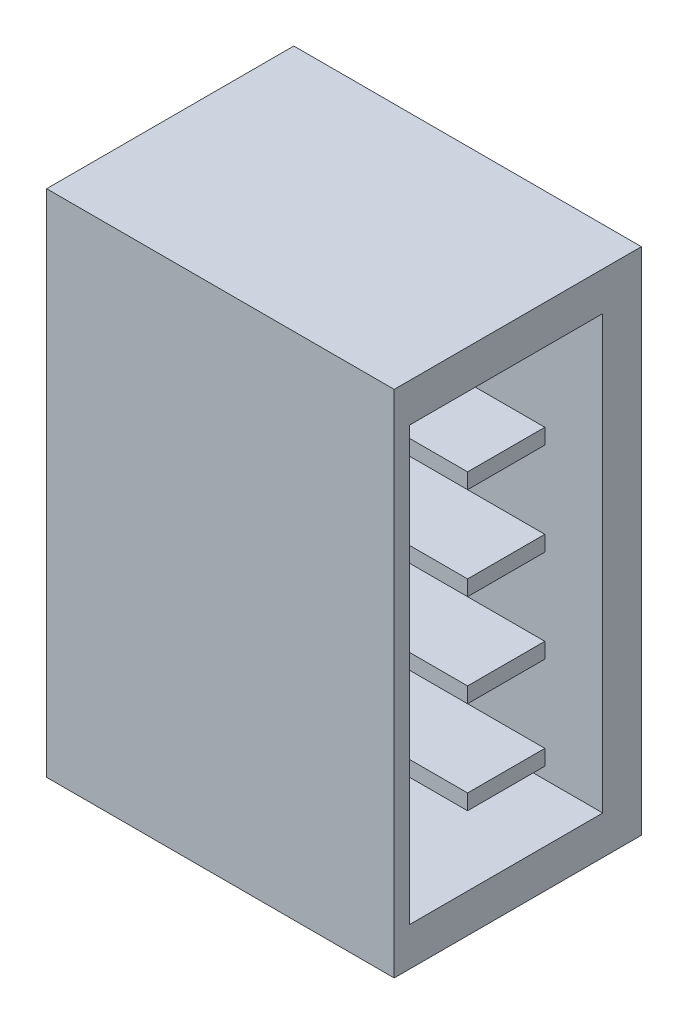
ISO-10303-21;
HEADER;
FILE_DESCRIPTION(('STEP AP214'),'2;1');
FILE_NAME('part.step','',(''),(''),'','','');
FILE_SCHEMA(('AUTOMOTIVE_DESIGN { 1 0 10303 214 1 1 1 1 }'));
ENDSEC;
DATA;
#1=APPLICATION_CONTEXT('core data for automotive mechanical design processes');
#2=APPLICATION_PROTOCOL_DEFINITION('international standard','automotive_design',2000,#1);
#3=PRODUCT_CONTEXT('',#1,'mechanical');
#4=PRODUCT('Part','Part','',(#3));
#5=PRODUCT_RELATED_PRODUCT_CATEGORY('part','',(#4));
#6=PRODUCT_DEFINITION_FORMATION('','',#4);
#7=PRODUCT_DEFINITION_CONTEXT('part definition',#1,'design');
#8=PRODUCT_DEFINITION('design','',#6,#7);
#9=PRODUCT_DEFINITION_SHAPE('','',#8);
#10=(LENGTH_UNIT() NAMED_UNIT(*) SI_UNIT(.MILLI.,.METRE.));
#11=(NAMED_UNIT(*) PLANE_ANGLE_UNIT() SI_UNIT($,.RADIAN.));
#12=(NAMED_UNIT(*) SI_UNIT($,.STERADIAN.) SOLID_ANGLE_UNIT());
#13=UNCERTAINTY_MEASURE_WITH_UNIT(LENGTH_MEASURE(1.E-05),#10,'distance_accuracy_value','');
#14=(GEOMETRIC_REPRESENTATION_CONTEXT(3) GLOBAL_UNCERTAINTY_ASSIGNED_CONTEXT((#13)) GLOBAL_UNIT_ASSIGNED_CONTEXT((#10,
#11,#12)) REPRESENTATION_CONTEXT('',''));
#15=CARTESIAN_POINT('',(0.,0.,0.));
#16=DIRECTION('',(0.,0.,1.));
#17=DIRECTION('',(1.,0.,0.));
#18=AXIS2_PLACEMENT_3D('',#15,#16,#17);
#19=CARTESIAN_POINT('',(14.5,1.3,-1.95));
#20=DIRECTION('',(0.,0.,1.));
#21=DIRECTION('',(0.,-1.,0.));
#22=AXIS2_PLACEMENT_3D('',#19,#20,#21);
#23=PLANE('',#22);
#24=DIRECTION('',(1.,0.,0.));
#25=VECTOR('',#24,1.);
#26=CARTESIAN_POINT('',(14.5,1.1,-1.95));
#27=LINE('',#26,#25);
#28=CARTESIAN_POINT('',(18.5,1.1,-1.95));
#29=VERTEX_POINT('',#28);
#30=CARTESIAN_POINT('',(14.5,1.1,-1.95));
#31=VERTEX_POINT('',#30);
#32=EDGE_CURVE('E189',#29,#31,#27,.F.);
#33=ORIENTED_EDGE('',*,*,#32,.T.);
#34=DIRECTION('',(0.,-1.,0.));
#35=VECTOR('',#34,1.);
#36=CARTESIAN_POINT('',(14.5,1.3,-1.95));
#37=LINE('',#36,#35);
#38=CARTESIAN_POINT('',(14.5,1.3,-1.95));
#39=VERTEX_POINT('',#38);
#40=EDGE_CURVE('E20',#39,#31,#37,.T.);
#41=ORIENTED_EDGE('',*,*,#40,.F.);
#42=DIRECTION('',(1.,0.,0.));
#43=VECTOR('',#42,1.);
#44=CARTESIAN_POINT('',(14.5,1.3,-1.95));
#45=LINE('',#44,#43);
#46=CARTESIAN_POINT('',(18.5,1.3,-1.95));
#47=VERTEX_POINT('',#46);
#48=EDGE_CURVE('E215',#39,#47,#45,.T.);
#49=ORIENTED_EDGE('',*,*,#48,.T.);
#50=DIRECTION('',(0.,-1.,0.));
#51=VECTOR('',#50,1.);
#52=CARTESIAN_POINT('',(18.5,1.3,-1.95));
#53=LINE('',#52,#51);
#54=EDGE_CURVE('E184',#29,#47,#53,.F.);
#55=ORIENTED_EDGE('',*,*,#54,.F.);
#56=EDGE_LOOP('',(#33,#41,#49,#55));
#57=FACE_BOUND('',#56,.T.);
#58=ADVANCED_FACE('F17',(#57),#23,.F.);
#59=CARTESIAN_POINT('',(14.5,2.5,-1.95));
#60=DIRECTION('',(0.,0.,1.));
#61=DIRECTION('',(0.,-1.,0.));
#62=AXIS2_PLACEMENT_3D('',#59,#60,#61);
#63=PLANE('',#62);
#64=DIRECTION('',(1.,0.,0.));
#65=VECTOR('',#64,1.);
#66=CARTESIAN_POINT('',(14.5,2.3,-1.95));
#67=LINE('',#66,#65);
#68=CARTESIAN_POINT('',(18.5,2.3,-1.95));
#69=VERTEX_POINT('',#68);
#70=CARTESIAN_POINT('',(14.5,2.3,-1.95));
#71=VERTEX_POINT('',#70);
#72=EDGE_CURVE('E222',#69,#71,#67,.F.);
#73=ORIENTED_EDGE('',*,*,#72,.T.);
#74=DIRECTION('',(0.,-1.,0.));
#75=VECTOR('',#74,1.);
#76=CARTESIAN_POINT('',(14.5,2.5,-1.95));
#77=LINE('',#76,#75);
#78=CARTESIAN_POINT('',(14.5,2.5,-1.95));
#79=VERTEX_POINT('',#78);
#80=EDGE_CURVE('E207',#79,#71,#77,.T.);
#81=ORIENTED_EDGE('',*,*,#80,.F.);
#82=DIRECTION('',(1.,0.,0.));
#83=VECTOR('',#82,1.);
#84=CARTESIAN_POINT('',(14.5,2.5,-1.95));
#85=LINE('',#84,#83);
#86=CARTESIAN_POINT('',(18.5,2.5,-1.95));
#87=VERTEX_POINT('',#86);
#88=EDGE_CURVE('E233',#79,#87,#85,.T.);
#89=ORIENTED_EDGE('',*,*,#88,.T.);
#90=DIRECTION('',(0.,-1.,0.));
#91=VECTOR('',#90,1.);
#92=CARTESIAN_POINT('',(18.5,2.5,-1.95));
#93=LINE('',#92,#91);
#94=EDGE_CURVE('E205',#69,#87,#93,.F.);
#95=ORIENTED_EDGE('',*,*,#94,.F.);
#96=EDGE_LOOP('',(#73,#81,#89,#95));
#97=FACE_BOUND('',#96,.T.);
#98=ADVANCED_FACE('F485',(#97),#63,.F.);
#99=CARTESIAN_POINT('',(14.5,3.7,-1.95));
#100=DIRECTION('',(0.,0.,1.));
#101=DIRECTION('',(0.,-1.,0.));
#102=AXIS2_PLACEMENT_3D('',#99,#100,#101);
#103=PLANE('',#102);
#104=DIRECTION('',(1.,0.,0.));
#105=VECTOR('',#104,1.);
#106=CARTESIAN_POINT('',(14.5,3.5,-1.95));
#107=LINE('',#106,#105);
#108=CARTESIAN_POINT('',(18.5,3.5,-1.95));
#109=VERTEX_POINT('',#108);
#110=CARTESIAN_POINT('',(14.5,3.5,-1.95));
#111=VERTEX_POINT('',#110);
#112=EDGE_CURVE('E241',#109,#111,#107,.F.);
#113=ORIENTED_EDGE('',*,*,#112,.T.);
#114=DIRECTION('',(0.,-1.,0.));
#115=VECTOR('',#114,1.);
#116=CARTESIAN_POINT('',(14.5,3.7,-1.95));
#117=LINE('',#116,#115);
#118=CARTESIAN_POINT('',(14.5,3.7,-1.95));
#119=VERTEX_POINT('',#118);
#120=EDGE_CURVE('E203',#119,#111,#117,.T.);
#121=ORIENTED_EDGE('',*,*,#120,.F.);
#122=DIRECTION('',(1.,0.,0.));
#123=VECTOR('',#122,1.);
#124=CARTESIAN_POINT('',(14.5,3.7,-1.95));
#125=LINE('',#124,#123);
#126=CARTESIAN_POINT('',(18.5,3.7,-1.95));
#127=VERTEX_POINT('',#126);
#128=EDGE_CURVE('E249',#119,#127,#125,.T.);
#129=ORIENTED_EDGE('',*,*,#128,.T.);
#130=DIRECTION('',(0.,-1.,0.));
#131=VECTOR('',#130,1.);
#132=CARTESIAN_POINT('',(18.5,3.7,-1.95));
#133=LINE('',#132,#131);
#134=EDGE_CURVE('E201',#109,#127,#133,.F.);
#135=ORIENTED_EDGE('',*,*,#134,.F.);
#136=EDGE_LOOP('',(#113,#121,#129,#135));
#137=FACE_BOUND('',#136,.T.);
#138=ADVANCED_FACE('F482',(#137),#103,.F.);
#139=CARTESIAN_POINT('',(14.5,4.9,-1.95));
#140=DIRECTION('',(0.,0.,1.));
#141=DIRECTION('',(0.,-1.,0.));
#142=AXIS2_PLACEMENT_3D('',#139,#140,#141);
#143=PLANE('',#142);
#144=DIRECTION('',(1.,0.,0.));
#145=VECTOR('',#144,1.);
#146=CARTESIAN_POINT('',(14.5,4.7,-1.95));
#147=LINE('',#146,#145);
#148=CARTESIAN_POINT('',(18.5,4.7,-1.95));
#149=VERTEX_POINT('',#148);
#150=CARTESIAN_POINT('',(14.5,4.7,-1.95));
#151=VERTEX_POINT('',#150);
#152=EDGE_CURVE('E257',#149,#151,#147,.F.);
#153=ORIENTED_EDGE('',*,*,#152,.T.);
#154=DIRECTION('',(0.,-1.,0.));
#155=VECTOR('',#154,1.);
#156=CARTESIAN_POINT('',(14.5,4.9,-1.95));
#157=LINE('',#156,#155);
#158=CARTESIAN_POINT('',(14.5,4.9,-1.95));
#159=VERTEX_POINT('',#158);
#160=EDGE_CURVE('E196',#159,#151,#157,.T.);
#161=ORIENTED_EDGE('',*,*,#160,.F.);
#162=DIRECTION('',(1.,0.,0.));
#163=VECTOR('',#162,1.);
#164=CARTESIAN_POINT('',(14.5,4.9,-1.95));
#165=LINE('',#164,#163);
#166=CARTESIAN_POINT('',(18.5,4.9,-1.95));
#167=VERTEX_POINT('',#166);
#168=EDGE_CURVE('E265',#159,#167,#165,.T.);
#169=ORIENTED_EDGE('',*,*,#168,.T.);
#170=DIRECTION('',(0.,-1.,0.));
#171=VECTOR('',#170,1.);
#172=CARTESIAN_POINT('',(18.5,4.9,-1.95));
#173=LINE('',#172,#171);
#174=EDGE_CURVE('E194',#149,#167,#173,.F.);
#175=ORIENTED_EDGE('',*,*,#174,.F.);
#176=EDGE_LOOP('',(#153,#161,#169,#175));
#177=FACE_BOUND('',#176,.T.);
#178=ADVANCED_FACE('F479',(#177),#143,.F.);
#179=CARTESIAN_POINT('',(14.5,1.1,-1.95));
#180=DIRECTION('',(0.,1.,0.));
#181=DIRECTION('',(0.,0.,1.));
#182=AXIS2_PLACEMENT_3D('',#179,#180,#181);
#183=PLANE('',#182);
#184=DIRECTION('',(1.,0.,0.));
#185=VECTOR('',#184,1.);
#186=CARTESIAN_POINT('',(14.5,1.1,-0.95));
#187=LINE('',#186,#185);
#188=CARTESIAN_POINT('',(18.5,1.1,-0.95));
#189=VERTEX_POINT('',#188);
#190=CARTESIAN_POINT('',(14.5,1.1,-0.95));
#191=VERTEX_POINT('',#190);
#192=EDGE_CURVE('E191',#189,#191,#187,.F.);
#193=ORIENTED_EDGE('',*,*,#192,.T.);
#194=DIRECTION('',(0.,0.,1.));
#195=VECTOR('',#194,1.);
#196=CARTESIAN_POINT('',(14.5,1.1,-1.95));
#197=LINE('',#196,#195);
#198=EDGE_CURVE('E181',#31,#191,#197,.T.);
#199=ORIENTED_EDGE('',*,*,#198,.F.);
#200=ORIENTED_EDGE('',*,*,#32,.F.);
#201=DIRECTION('',(0.,0.,1.));
#202=VECTOR('',#201,1.);
#203=CARTESIAN_POINT('',(18.5,1.1,-3.2));
#204=LINE('',#203,#202);
#205=EDGE_CURVE('E214',#189,#29,#204,.F.);
#206=ORIENTED_EDGE('',*,*,#205,.F.);
#207=EDGE_LOOP('',(#193,#199,#200,#206));
#208=FACE_BOUND('',#207,.T.);
#209=ADVANCED_FACE('F187',(#208),#183,.F.);
#210=CARTESIAN_POINT('',(14.5,1.3,-0.95));
#211=DIRECTION('',(0.,-1.,0.));
#212=DIRECTION('',(0.,0.,-1.));
#213=AXIS2_PLACEMENT_3D('',#210,#211,#212);
#214=PLANE('',#213);
#215=ORIENTED_EDGE('',*,*,#48,.F.);
#216=DIRECTION('',(0.,0.,-1.));
#217=VECTOR('',#216,1.);
#218=CARTESIAN_POINT('',(14.5,1.3,-0.95));
#219=LINE('',#218,#217);
#220=CARTESIAN_POINT('',(14.5,1.3,-0.95));
#221=VERTEX_POINT('',#220);
#222=EDGE_CURVE('E183',#221,#39,#219,.T.);
#223=ORIENTED_EDGE('',*,*,#222,.F.);
#224=DIRECTION('',(1.,0.,0.));
#225=VECTOR('',#224,1.);
#226=CARTESIAN_POINT('',(14.5,1.3,-0.95));
#227=LINE('',#226,#225);
#228=CARTESIAN_POINT('',(18.5,1.3,-0.95));
#229=VERTEX_POINT('',#228);
#230=EDGE_CURVE('E221',#221,#229,#227,.T.);
#231=ORIENTED_EDGE('',*,*,#230,.T.);
#232=DIRECTION('',(0.,0.,1.));
#233=VECTOR('',#232,1.);
#234=CARTESIAN_POINT('',(18.5,1.3,-3.2));
#235=LINE('',#234,#233);
#236=EDGE_CURVE('E212',#47,#229,#235,.T.);
#237=ORIENTED_EDGE('',*,*,#236,.F.);
#238=EDGE_LOOP('',(#215,#223,#231,#237));
#239=FACE_BOUND('',#238,.T.);
#240=ADVANCED_FACE('F219',(#239),#214,.F.);
#241=CARTESIAN_POINT('',(18.5,-0.299999999999995,-3.2));
#242=DIRECTION('',(1.,0.,0.));
#243=DIRECTION('',(0.,1.,0.));
#244=AXIS2_PLACEMENT_3D('',#241,#242,#243);
#245=PLANE('',#244);
#246=ORIENTED_EDGE('',*,*,#54,.T.);
#247=ORIENTED_EDGE('',*,*,#236,.T.);
#248=DIRECTION('',(0.,1.,0.));
#249=VECTOR('',#248,1.);
#250=CARTESIAN_POINT('',(18.5,1.1,-0.949999999999999));
#251=LINE('',#250,#249);
#252=EDGE_CURVE('E275',#229,#189,#251,.F.);
#253=ORIENTED_EDGE('',*,*,#252,.T.);
#254=ORIENTED_EDGE('',*,*,#205,.T.);
#255=EDGE_LOOP('',(#246,#247,#253,#254));
#256=FACE_BOUND('',#255,.T.);
#257=ADVANCED_FACE('F209',(#256),#245,.T.);
#258=CARTESIAN_POINT('',(14.5,2.3,-1.95));
#259=DIRECTION('',(0.,1.,0.));
#260=DIRECTION('',(0.,0.,1.));
#261=AXIS2_PLACEMENT_3D('',#258,#259,#260);
#262=PLANE('',#261);
#263=DIRECTION('',(1.,0.,0.));
#264=VECTOR('',#263,1.);
#265=CARTESIAN_POINT('',(14.5,2.3,-0.95));
#266=LINE('',#265,#264);
#267=CARTESIAN_POINT('',(18.5,2.3,-0.95));
#268=VERTEX_POINT('',#267);
#269=CARTESIAN_POINT('',(14.5,2.3,-0.95));
#270=VERTEX_POINT('',#269);
#271=EDGE_CURVE('E277',#268,#270,#266,.F.);
#272=ORIENTED_EDGE('',*,*,#271,.T.);
#273=DIRECTION('',(0.,0.,1.));
#274=VECTOR('',#273,1.);
#275=CARTESIAN_POINT('',(14.5,2.3,-1.95));
#276=LINE('',#275,#274);
#277=EDGE_CURVE('E225',#71,#270,#276,.T.);
#278=ORIENTED_EDGE('',*,*,#277,.F.);
#279=ORIENTED_EDGE('',*,*,#72,.F.);
#280=DIRECTION('',(0.,0.,1.));
#281=VECTOR('',#280,1.);
#282=CARTESIAN_POINT('',(18.5,2.3,-3.2));
#283=LINE('',#282,#281);
#284=EDGE_CURVE('E236',#268,#69,#283,.F.);
#285=ORIENTED_EDGE('',*,*,#284,.F.);
#286=EDGE_LOOP('',(#272,#278,#279,#285));
#287=FACE_BOUND('',#286,.T.);
#288=ADVANCED_FACE('F468',(#287),#262,.F.);
#289=CARTESIAN_POINT('',(14.5,2.5,-0.95));
#290=DIRECTION('',(0.,-1.,0.));
#291=DIRECTION('',(0.,0.,-1.));
#292=AXIS2_PLACEMENT_3D('',#289,#290,#291);
#293=PLANE('',#292);
#294=ORIENTED_EDGE('',*,*,#88,.F.);
#295=DIRECTION('',(0.,0.,-1.));
#296=VECTOR('',#295,1.);
#297=CARTESIAN_POINT('',(14.5,2.5,-0.95));
#298=LINE('',#297,#296);
#299=CARTESIAN_POINT('',(14.5,2.5,-0.95));
#300=VERTEX_POINT('',#299);
#301=EDGE_CURVE('E230',#300,#79,#298,.T.);
#302=ORIENTED_EDGE('',*,*,#301,.F.);
#303=DIRECTION('',(1.,0.,0.));
#304=VECTOR('',#303,1.);
#305=CARTESIAN_POINT('',(14.5,2.5,-0.95));
#306=LINE('',#305,#304);
#307=CARTESIAN_POINT('',(18.5,2.5,-0.95));
#308=VERTEX_POINT('',#307);
#309=EDGE_CURVE('E280',#300,#308,#306,.T.);
#310=ORIENTED_EDGE('',*,*,#309,.T.);
#311=DIRECTION('',(0.,0.,1.));
#312=VECTOR('',#311,1.);
#313=CARTESIAN_POINT('',(18.5,2.5,-3.2));
#314=LINE('',#313,#312);
#315=EDGE_CURVE('E239',#87,#308,#314,.T.);
#316=ORIENTED_EDGE('',*,*,#315,.F.);
#317=EDGE_LOOP('',(#294,#302,#310,#316));
#318=FACE_BOUND('',#317,.T.);
#319=ADVANCED_FACE('F464',(#318),#293,.F.);
#320=CARTESIAN_POINT('',(18.5,-0.299999999999995,-3.2));
#321=DIRECTION('',(1.,0.,0.));
#322=DIRECTION('',(0.,1.,0.));
#323=AXIS2_PLACEMENT_3D('',#320,#321,#322);
#324=PLANE('',#323);
#325=ORIENTED_EDGE('',*,*,#94,.T.);
#326=ORIENTED_EDGE('',*,*,#315,.T.);
#327=DIRECTION('',(0.,1.,0.));
#328=VECTOR('',#327,1.);
#329=CARTESIAN_POINT('',(18.5,2.3,-0.949999999999999));
#330=LINE('',#329,#328);
#331=EDGE_CURVE('E283',#308,#268,#330,.F.);
#332=ORIENTED_EDGE('',*,*,#331,.T.);
#333=ORIENTED_EDGE('',*,*,#284,.T.);
#334=EDGE_LOOP('',(#325,#326,#332,#333));
#335=FACE_BOUND('',#334,.T.);
#336=ADVANCED_FACE('F460',(#335),#324,.T.);
#337=CARTESIAN_POINT('',(14.5,3.5,-1.95));
#338=DIRECTION('',(0.,1.,0.));
#339=DIRECTION('',(0.,0.,1.));
#340=AXIS2_PLACEMENT_3D('',#337,#338,#339);
#341=PLANE('',#340);
#342=DIRECTION('',(1.,0.,0.));
#343=VECTOR('',#342,1.);
#344=CARTESIAN_POINT('',(14.5,3.5,-0.95));
#345=LINE('',#344,#343);
#346=CARTESIAN_POINT('',(18.5,3.5,-0.95));
#347=VERTEX_POINT('',#346);
#348=CARTESIAN_POINT('',(14.5,3.5,-0.95));
#349=VERTEX_POINT('',#348);
#350=EDGE_CURVE('E286',#347,#349,#345,.F.);
#351=ORIENTED_EDGE('',*,*,#350,.T.);
#352=DIRECTION('',(0.,0.,1.));
#353=VECTOR('',#352,1.);
#354=CARTESIAN_POINT('',(14.5,3.5,-1.95));
#355=LINE('',#354,#353);
#356=EDGE_CURVE('E244',#111,#349,#355,.T.);
#357=ORIENTED_EDGE('',*,*,#356,.F.);
#358=ORIENTED_EDGE('',*,*,#112,.F.);
#359=DIRECTION('',(0.,0.,1.));
#360=VECTOR('',#359,1.);
#361=CARTESIAN_POINT('',(18.5,3.5,-3.2));
#362=LINE('',#361,#360);
#363=EDGE_CURVE('E252',#347,#109,#362,.F.);
#364=ORIENTED_EDGE('',*,*,#363,.F.);
#365=EDGE_LOOP('',(#351,#357,#358,#364));
#366=FACE_BOUND('',#365,.T.);
#367=ADVANCED_FACE('F456',(#366),#341,.F.);
#368=CARTESIAN_POINT('',(14.5,3.7,-0.95));
#369=DIRECTION('',(0.,-1.,0.));
#370=DIRECTION('',(0.,0.,-1.));
#371=AXIS2_PLACEMENT_3D('',#368,#369,#370);
#372=PLANE('',#371);
#373=ORIENTED_EDGE('',*,*,#128,.F.);
#374=DIRECTION('',(0.,0.,-1.));
#375=VECTOR('',#374,1.);
#376=CARTESIAN_POINT('',(14.5,3.7,-0.95));
#377=LINE('',#376,#375);
#378=CARTESIAN_POINT('',(14.5,3.7,-0.95));
#379=VERTEX_POINT('',#378);
#380=EDGE_CURVE('E246',#379,#119,#377,.T.);
#381=ORIENTED_EDGE('',*,*,#380,.F.);
#382=DIRECTION('',(1.,0.,0.));
#383=VECTOR('',#382,1.);
#384=CARTESIAN_POINT('',(14.5,3.7,-0.95));
#385=LINE('',#384,#383);
#386=CARTESIAN_POINT('',(18.5,3.7,-0.95));
#387=VERTEX_POINT('',#386);
#388=EDGE_CURVE('E289',#379,#387,#385,.T.);
#389=ORIENTED_EDGE('',*,*,#388,.T.);
#390=DIRECTION('',(0.,0.,1.));
#391=VECTOR('',#390,1.);
#392=CARTESIAN_POINT('',(18.5,3.7,-3.2));
#393=LINE('',#392,#391);
#394=EDGE_CURVE('E255',#127,#387,#393,.T.);
#395=ORIENTED_EDGE('',*,*,#394,.F.);
#396=EDGE_LOOP('',(#373,#381,#389,#395));
#397=FACE_BOUND('',#396,.T.);
#398=ADVANCED_FACE('F452',(#397),#372,.F.);
#399=CARTESIAN_POINT('',(18.5,-0.299999999999995,-3.2));
#400=DIRECTION('',(1.,0.,0.));
#401=DIRECTION('',(0.,1.,0.));
#402=AXIS2_PLACEMENT_3D('',#399,#400,#401);
#403=PLANE('',#402);
#404=ORIENTED_EDGE('',*,*,#134,.T.);
#405=ORIENTED_EDGE('',*,*,#394,.T.);
#406=DIRECTION('',(0.,1.,0.));
#407=VECTOR('',#406,1.);
#408=CARTESIAN_POINT('',(18.5,3.5,-0.949999999999999));
#409=LINE('',#408,#407);
#410=EDGE_CURVE('E292',#387,#347,#409,.F.);
#411=ORIENTED_EDGE('',*,*,#410,.T.);
#412=ORIENTED_EDGE('',*,*,#363,.T.);
#413=EDGE_LOOP('',(#404,#405,#411,#412));
#414=FACE_BOUND('',#413,.T.);
#415=ADVANCED_FACE('F448',(#414),#403,.T.);
#416=CARTESIAN_POINT('',(14.5,4.7,-1.95));
#417=DIRECTION('',(0.,1.,0.));
#418=DIRECTION('',(0.,0.,1.));
#419=AXIS2_PLACEMENT_3D('',#416,#417,#418);
#420=PLANE('',#419);
#421=DIRECTION('',(-1.,0.,0.));
#422=VECTOR('',#421,1.);
#423=CARTESIAN_POINT('',(14.5,4.7,-0.95));
#424=LINE('',#423,#422);
#425=CARTESIAN_POINT('',(18.5,4.7,-0.95));
#426=VERTEX_POINT('',#425);
#427=CARTESIAN_POINT('',(14.5,4.7,-0.95));
#428=VERTEX_POINT('',#427);
#429=EDGE_CURVE('E295',#426,#428,#424,.T.);
#430=ORIENTED_EDGE('',*,*,#429,.T.);
#431=DIRECTION('',(0.,0.,1.));
#432=VECTOR('',#431,1.);
#433=CARTESIAN_POINT('',(14.5,4.7,-1.95));
#434=LINE('',#433,#432);
#435=EDGE_CURVE('E260',#151,#428,#434,.T.);
#436=ORIENTED_EDGE('',*,*,#435,.F.);
#437=ORIENTED_EDGE('',*,*,#152,.F.);
#438=DIRECTION('',(0.,0.,1.));
#439=VECTOR('',#438,1.);
#440=CARTESIAN_POINT('',(18.5,4.7,-3.2));
#441=LINE('',#440,#439);
#442=EDGE_CURVE('E268',#426,#149,#441,.F.);
#443=ORIENTED_EDGE('',*,*,#442,.F.);
#444=EDGE_LOOP('',(#430,#436,#437,#443));
#445=FACE_BOUND('',#444,.T.);
#446=ADVANCED_FACE('F444',(#445),#420,.F.);
#447=CARTESIAN_POINT('',(14.5,4.9,-0.95));
#448=DIRECTION('',(0.,-1.,0.));
#449=DIRECTION('',(0.,0.,-1.));
#450=AXIS2_PLACEMENT_3D('',#447,#448,#449);
#451=PLANE('',#450);
#452=ORIENTED_EDGE('',*,*,#168,.F.);
#453=DIRECTION('',(0.,0.,-1.));
#454=VECTOR('',#453,1.);
#455=CARTESIAN_POINT('',(14.5,4.9,-0.95));
#456=LINE('',#455,#454);
#457=CARTESIAN_POINT('',(14.5,4.9,-0.95));
#458=VERTEX_POINT('',#457);
#459=EDGE_CURVE('E262',#458,#159,#456,.T.);
#460=ORIENTED_EDGE('',*,*,#459,.F.);
#461=DIRECTION('',(-1.,0.,0.));
#462=VECTOR('',#461,1.);
#463=CARTESIAN_POINT('',(14.5,4.9,-0.95));
#464=LINE('',#463,#462);
#465=CARTESIAN_POINT('',(18.5,4.9,-0.95));
#466=VERTEX_POINT('',#465);
#467=EDGE_CURVE('E298',#458,#466,#464,.F.);
#468=ORIENTED_EDGE('',*,*,#467,.T.);
#469=DIRECTION('',(0.,0.,1.));
#470=VECTOR('',#469,1.);
#471=CARTESIAN_POINT('',(18.5,4.9,-3.2));
#472=LINE('',#471,#470);
#473=EDGE_CURVE('E271',#167,#466,#472,.T.);
#474=ORIENTED_EDGE('',*,*,#473,.F.);
#475=EDGE_LOOP('',(#452,#460,#468,#474));
#476=FACE_BOUND('',#475,.T.);
#477=ADVANCED_FACE('F440',(#476),#451,.F.);
#478=CARTESIAN_POINT('',(18.5,-0.299999999999995,-3.2));
#479=DIRECTION('',(1.,0.,0.));
#480=DIRECTION('',(0.,1.,0.));
#481=AXIS2_PLACEMENT_3D('',#478,#479,#480);
#482=PLANE('',#481);
#483=ORIENTED_EDGE('',*,*,#174,.T.);
#484=ORIENTED_EDGE('',*,*,#473,.T.);
#485=DIRECTION('',(0.,1.,0.));
#486=VECTOR('',#485,1.);
#487=CARTESIAN_POINT('',(18.5,4.7,-0.949999999999999));
#488=LINE('',#487,#486);
#489=EDGE_CURVE('E301',#466,#426,#488,.F.);
#490=ORIENTED_EDGE('',*,*,#489,.T.);
#491=ORIENTED_EDGE('',*,*,#442,.T.);
#492=EDGE_LOOP('',(#483,#484,#490,#491));
#493=FACE_BOUND('',#492,.T.);
#494=ADVANCED_FACE('F436',(#493),#482,.T.);
#495=CARTESIAN_POINT('',(14.5,1.1,-0.95));
#496=DIRECTION('',(0.,0.,-1.));
#497=DIRECTION('',(0.,1.,0.));
#498=AXIS2_PLACEMENT_3D('',#495,#496,#497);
#499=PLANE('',#498);
#500=ORIENTED_EDGE('',*,*,#230,.F.);
#501=DIRECTION('',(0.,1.,0.));
#502=VECTOR('',#501,1.);
#503=CARTESIAN_POINT('',(14.5,3.,-0.95));
#504=LINE('',#503,#502);
#505=EDGE_CURVE('E304',#221,#191,#504,.F.);
#506=ORIENTED_EDGE('',*,*,#505,.T.);
#507=ORIENTED_EDGE('',*,*,#192,.F.);
#508=ORIENTED_EDGE('',*,*,#252,.F.);
#509=EDGE_LOOP('',(#500,#506,#507,#508));
#510=FACE_BOUND('',#509,.T.);
#511=ADVANCED_FACE('F432',(#510),#499,.F.);
#512=CARTESIAN_POINT('',(14.5,2.3,-0.95));
#513=DIRECTION('',(0.,0.,-1.));
#514=DIRECTION('',(0.,1.,0.));
#515=AXIS2_PLACEMENT_3D('',#512,#513,#514);
#516=PLANE('',#515);
#517=ORIENTED_EDGE('',*,*,#309,.F.);
#518=DIRECTION('',(0.,1.,0.));
#519=VECTOR('',#518,1.);
#520=CARTESIAN_POINT('',(14.5,3.,-0.95));
#521=LINE('',#520,#519);
#522=EDGE_CURVE('E306',#300,#270,#521,.F.);
#523=ORIENTED_EDGE('',*,*,#522,.T.);
#524=ORIENTED_EDGE('',*,*,#271,.F.);
#525=ORIENTED_EDGE('',*,*,#331,.F.);
#526=EDGE_LOOP('',(#517,#523,#524,#525));
#527=FACE_BOUND('',#526,.T.);
#528=ADVANCED_FACE('F428',(#527),#516,.F.);
#529=CARTESIAN_POINT('',(14.5,3.5,-0.95));
#530=DIRECTION('',(0.,0.,-1.));
#531=DIRECTION('',(0.,1.,0.));
#532=AXIS2_PLACEMENT_3D('',#529,#530,#531);
#533=PLANE('',#532);
#534=ORIENTED_EDGE('',*,*,#388,.F.);
#535=DIRECTION('',(0.,1.,0.));
#536=VECTOR('',#535,1.);
#537=CARTESIAN_POINT('',(14.5,3.,-0.95));
#538=LINE('',#537,#536);
#539=EDGE_CURVE('E309',#379,#349,#538,.F.);
#540=ORIENTED_EDGE('',*,*,#539,.T.);
#541=ORIENTED_EDGE('',*,*,#350,.F.);
#542=ORIENTED_EDGE('',*,*,#410,.F.);
#543=EDGE_LOOP('',(#534,#540,#541,#542));
#544=FACE_BOUND('',#543,.T.);
#545=ADVANCED_FACE('F424',(#544),#533,.F.);
#546=CARTESIAN_POINT('',(14.5,4.7,-0.95));
#547=DIRECTION('',(0.,0.,-1.));
#548=DIRECTION('',(-1.,0.,0.));
#549=AXIS2_PLACEMENT_3D('',#546,#547,#548);
#550=PLANE('',#549);
#551=ORIENTED_EDGE('',*,*,#467,.F.);
#552=DIRECTION('',(0.,1.,0.));
#553=VECTOR('',#552,1.);
#554=CARTESIAN_POINT('',(14.5,3.,-0.95));
#555=LINE('',#554,#553);
#556=EDGE_CURVE('E312',#458,#428,#555,.F.);
#557=ORIENTED_EDGE('',*,*,#556,.T.);
#558=ORIENTED_EDGE('',*,*,#429,.F.);
#559=ORIENTED_EDGE('',*,*,#489,.F.);
#560=EDGE_LOOP('',(#551,#557,#558,#559));
#561=FACE_BOUND('',#560,.T.);
#562=ADVANCED_FACE('F420',(#561),#550,.F.);
#563=CARTESIAN_POINT('',(14.5,3.,-1.45));
#564=DIRECTION('',(-1.,0.,0.));
#565=DIRECTION('',(0.,0.,1.));
#566=AXIS2_PLACEMENT_3D('',#563,#564,#565);
#567=PLANE('',#566);
#568=DIRECTION('',(0.,0.,1.));
#569=VECTOR('',#568,1.);
#570=CARTESIAN_POINT('',(14.5,0.200000000000006,-2.7));
#571=LINE('',#570,#569);
#572=CARTESIAN_POINT('',(14.5,0.200000000000006,-2.7));
#573=VERTEX_POINT('',#572);
#574=CARTESIAN_POINT('',(14.5,0.200000000000008,-0.199999999999995));
#575=VERTEX_POINT('',#574);
#576=EDGE_CURVE('E315',#573,#575,#571,.T.);
#577=ORIENTED_EDGE('',*,*,#576,.F.);
#578=DIRECTION('',(0.,-1.,0.));
#579=VECTOR('',#578,1.);
#580=CARTESIAN_POINT('',(14.5,5.8,-2.7));
#581=LINE('',#580,#579);
#582=CARTESIAN_POINT('',(14.5,5.8,-2.7));
#583=VERTEX_POINT('',#582);
#584=EDGE_CURVE('E330',#583,#573,#581,.T.);
#585=ORIENTED_EDGE('',*,*,#584,.F.);
#586=DIRECTION('',(0.,0.,-1.));
#587=VECTOR('',#586,1.);
#588=CARTESIAN_POINT('',(14.5,5.8,-0.199999999999996));
#589=LINE('',#588,#587);
#590=CARTESIAN_POINT('',(14.5,5.8,-0.199999999999996));
#591=VERTEX_POINT('',#590);
#592=EDGE_CURVE('E325',#591,#583,#589,.T.);
#593=ORIENTED_EDGE('',*,*,#592,.F.);
#594=DIRECTION('',(0.,1.,0.));
#595=VECTOR('',#594,1.);
#596=CARTESIAN_POINT('',(14.5,0.200000000000009,-0.199999999999996));
#597=LINE('',#596,#595);
#598=EDGE_CURVE('E320',#575,#591,#597,.T.);
#599=ORIENTED_EDGE('',*,*,#598,.F.);
#600=EDGE_LOOP('',(#577,#585,#593,#599));
#601=FACE_BOUND('',#600,.T.);
#602=ORIENTED_EDGE('',*,*,#459,.T.);
#603=ORIENTED_EDGE('',*,*,#160,.T.);
#604=ORIENTED_EDGE('',*,*,#435,.T.);
#605=ORIENTED_EDGE('',*,*,#556,.F.);
#606=EDGE_LOOP('',(#602,#603,#604,#605));
#607=FACE_BOUND('',#606,.T.);
#608=ORIENTED_EDGE('',*,*,#380,.T.);
#609=ORIENTED_EDGE('',*,*,#120,.T.);
#610=ORIENTED_EDGE('',*,*,#356,.T.);
#611=ORIENTED_EDGE('',*,*,#539,.F.);
#612=EDGE_LOOP('',(#608,#609,#610,#611));
#613=FACE_BOUND('',#612,.T.);
#614=ORIENTED_EDGE('',*,*,#301,.T.);
#615=ORIENTED_EDGE('',*,*,#80,.T.);
#616=ORIENTED_EDGE('',*,*,#277,.T.);
#617=ORIENTED_EDGE('',*,*,#522,.F.);
#618=EDGE_LOOP('',(#614,#615,#616,#617));
#619=FACE_BOUND('',#618,.T.);
#620=ORIENTED_EDGE('',*,*,#222,.T.);
#621=ORIENTED_EDGE('',*,*,#40,.T.);
#622=ORIENTED_EDGE('',*,*,#198,.T.);
#623=ORIENTED_EDGE('',*,*,#505,.F.);
#624=EDGE_LOOP('',(#620,#621,#622,#623));
#625=FACE_BOUND('',#624,.T.);
#626=ADVANCED_FACE('F179',(#601,#607,#613,#619,#625),#567,.F.);
#627=CARTESIAN_POINT('',(0.,0.,0.));
#628=DIRECTION('',(0.,0.,1.));
#629=DIRECTION('',(1.,0.,0.));
#630=AXIS2_PLACEMENT_3D('',#627,#628,#629);
#631=PLANE('',#630);
#632=DIRECTION('',(0.,-1.,0.));
#633=VECTOR('',#632,1.);
#634=CARTESIAN_POINT('',(14.,6.3,0.));
#635=LINE('',#634,#633);
#636=CARTESIAN_POINT('',(14.,-0.3,0.));
#637=VERTEX_POINT('',#636);
#638=CARTESIAN_POINT('',(14.,6.3,0.));
#639=VERTEX_POINT('',#638);
#640=EDGE_CURVE('E336',#637,#639,#635,.F.);
#641=ORIENTED_EDGE('',*,*,#640,.F.);
#642=DIRECTION('',(1.,0.,0.));
#643=VECTOR('',#642,1.);
#644=CARTESIAN_POINT('',(14.,-0.3,0.));
#645=LINE('',#644,#643);
#646=CARTESIAN_POINT('',(18.5,-0.299999999999998,0.));
#647=VERTEX_POINT('',#646);
#648=EDGE_CURVE('E340',#647,#637,#645,.F.);
#649=ORIENTED_EDGE('',*,*,#648,.F.);
#650=DIRECTION('',(0.,1.,0.));
#651=VECTOR('',#650,1.);
#652=CARTESIAN_POINT('',(18.5,-0.299999999999995,0.));
#653=LINE('',#652,#651);
#654=CARTESIAN_POINT('',(18.5,6.3,0.));
#655=VERTEX_POINT('',#654);
#656=EDGE_CURVE('E344',#655,#647,#653,.F.);
#657=ORIENTED_EDGE('',*,*,#656,.F.);
#658=DIRECTION('',(-1.,0.,0.));
#659=VECTOR('',#658,1.);
#660=CARTESIAN_POINT('',(18.5,6.3,0.));
#661=LINE('',#660,#659);
#662=EDGE_CURVE('E334',#639,#655,#661,.F.);
#663=ORIENTED_EDGE('',*,*,#662,.F.);
#664=EDGE_LOOP('',(#641,#649,#657,#663));
#665=FACE_BOUND('',#664,.T.);
#666=ADVANCED_FACE('F413',(#665),#631,.T.);
#667=CARTESIAN_POINT('',(14.5,0.200000000000006,-2.7));
#668=DIRECTION('',(0.,1.,0.));
#669=DIRECTION('',(0.,0.,1.));
#670=AXIS2_PLACEMENT_3D('',#667,#668,#669);
#671=PLANE('',#670);
#672=ORIENTED_EDGE('',*,*,#576,.T.);
#673=DIRECTION('',(-1.,0.,0.));
#674=VECTOR('',#673,1.);
#675=CARTESIAN_POINT('',(14.5,0.200000000000009,-0.199999999999996));
#676=LINE('',#675,#674);
#677=CARTESIAN_POINT('',(18.5,0.200000000000008,-0.199999999999995));
#678=VERTEX_POINT('',#677);
#679=EDGE_CURVE('E317',#678,#575,#676,.T.);
#680=ORIENTED_EDGE('',*,*,#679,.F.);
#681=DIRECTION('',(0.,0.,1.));
#682=VECTOR('',#681,1.);
#683=CARTESIAN_POINT('',(18.5,0.200000000000006,-3.2));
#684=LINE('',#683,#682);
#685=CARTESIAN_POINT('',(18.5,0.200000000000006,-2.7));
#686=VERTEX_POINT('',#685);
#687=EDGE_CURVE('E350',#686,#678,#684,.T.);
#688=ORIENTED_EDGE('',*,*,#687,.F.);
#689=DIRECTION('',(1.,0.,0.));
#690=VECTOR('',#689,1.);
#691=CARTESIAN_POINT('',(14.5,0.200000000000006,-2.69999999999999));
#692=LINE('',#691,#690);
#693=EDGE_CURVE('E332',#573,#686,#692,.T.);
#694=ORIENTED_EDGE('',*,*,#693,.F.);
#695=EDGE_LOOP('',(#672,#680,#688,#694));
#696=FACE_BOUND('',#695,.T.);
#697=ADVANCED_FACE('F409',(#696),#671,.T.);
#698=CARTESIAN_POINT('',(14.5,0.200000000000009,-0.199999999999996));
#699=DIRECTION('',(0.,0.,-1.));
#700=DIRECTION('',(-1.,0.,0.));
#701=AXIS2_PLACEMENT_3D('',#698,#699,#700);
#702=PLANE('',#701);
#703=ORIENTED_EDGE('',*,*,#598,.T.);
#704=DIRECTION('',(1.,0.,0.));
#705=VECTOR('',#704,1.);
#706=CARTESIAN_POINT('',(14.5,5.8,-0.199999999999996));
#707=LINE('',#706,#705);
#708=CARTESIAN_POINT('',(18.5,5.8,-0.199999999999995));
#709=VERTEX_POINT('',#708);
#710=EDGE_CURVE('E322',#709,#591,#707,.F.);
#711=ORIENTED_EDGE('',*,*,#710,.F.);
#712=DIRECTION('',(0.,1.,0.));
#713=VECTOR('',#712,1.);
#714=CARTESIAN_POINT('',(18.5,-0.299999999999995,-0.199999999999995));
#715=LINE('',#714,#713);
#716=EDGE_CURVE('E352',#678,#709,#715,.T.);
#717=ORIENTED_EDGE('',*,*,#716,.F.);
#718=ORIENTED_EDGE('',*,*,#679,.T.);
#719=EDGE_LOOP('',(#703,#711,#717,#718));
#720=FACE_BOUND('',#719,.T.);
#721=ADVANCED_FACE('F405',(#720),#702,.T.);
#722=CARTESIAN_POINT('',(14.5,5.8,-0.199999999999996));
#723=DIRECTION('',(0.,-1.,0.));
#724=DIRECTION('',(0.,0.,-1.));
#725=AXIS2_PLACEMENT_3D('',#722,#723,#724);
#726=PLANE('',#725);
#727=ORIENTED_EDGE('',*,*,#592,.T.);
#728=DIRECTION('',(1.,0.,0.));
#729=VECTOR('',#728,1.);
#730=CARTESIAN_POINT('',(14.5,5.8,-2.7));
#731=LINE('',#730,#729);
#732=CARTESIAN_POINT('',(18.5,5.8,-2.7));
#733=VERTEX_POINT('',#732);
#734=EDGE_CURVE('E327',#733,#583,#731,.F.);
#735=ORIENTED_EDGE('',*,*,#734,.F.);
#736=DIRECTION('',(0.,0.,1.));
#737=VECTOR('',#736,1.);
#738=CARTESIAN_POINT('',(18.5,5.8,-3.2));
#739=LINE('',#738,#737);
#740=EDGE_CURVE('E354',#709,#733,#739,.F.);
#741=ORIENTED_EDGE('',*,*,#740,.F.);
#742=ORIENTED_EDGE('',*,*,#710,.T.);
#743=EDGE_LOOP('',(#727,#735,#741,#742));
#744=FACE_BOUND('',#743,.T.);
#745=ADVANCED_FACE('F401',(#744),#726,.T.);
#746=CARTESIAN_POINT('',(14.5,5.8,-2.7));
#747=DIRECTION('',(0.,0.,1.));
#748=DIRECTION('',(0.,-1.,0.));
#749=AXIS2_PLACEMENT_3D('',#746,#747,#748);
#750=PLANE('',#749);
#751=ORIENTED_EDGE('',*,*,#584,.T.);
#752=ORIENTED_EDGE('',*,*,#693,.T.);
#753=DIRECTION('',(0.,1.,0.));
#754=VECTOR('',#753,1.);
#755=CARTESIAN_POINT('',(18.5,-0.299999999999995,-2.7));
#756=LINE('',#755,#754);
#757=EDGE_CURVE('E356',#733,#686,#756,.F.);
#758=ORIENTED_EDGE('',*,*,#757,.F.);
#759=ORIENTED_EDGE('',*,*,#734,.T.);
#760=EDGE_LOOP('',(#751,#752,#758,#759));
#761=FACE_BOUND('',#760,.T.);
#762=ADVANCED_FACE('F398',(#761),#750,.T.);
#763=CARTESIAN_POINT('',(18.5,6.3,-3.2));
#764=DIRECTION('',(0.,1.,0.));
#765=DIRECTION('',(-1.,0.,0.));
#766=AXIS2_PLACEMENT_3D('',#763,#764,#765);
#767=PLANE('',#766);
#768=DIRECTION('',(1.,0.,0.));
#769=VECTOR('',#768,1.);
#770=CARTESIAN_POINT('',(0.,6.3,-3.2));
#771=LINE('',#770,#769);
#772=CARTESIAN_POINT('',(18.5,6.3,-3.2));
#773=VERTEX_POINT('',#772);
#774=CARTESIAN_POINT('',(14.,6.3,-3.2));
#775=VERTEX_POINT('',#774);
#776=EDGE_CURVE('E359',#773,#775,#771,.F.);
#777=ORIENTED_EDGE('',*,*,#776,.T.);
#778=DIRECTION('',(0.,0.,1.));
#779=VECTOR('',#778,1.);
#780=CARTESIAN_POINT('',(14.,6.3,-3.2));
#781=LINE('',#780,#779);
#782=EDGE_CURVE('E338',#639,#775,#781,.F.);
#783=ORIENTED_EDGE('',*,*,#782,.F.);
#784=ORIENTED_EDGE('',*,*,#662,.T.);
#785=DIRECTION('',(0.,0.,1.));
#786=VECTOR('',#785,1.);
#787=CARTESIAN_POINT('',(18.5,6.3,-3.2));
#788=LINE('',#787,#786);
#789=EDGE_CURVE('E347',#773,#655,#788,.T.);
#790=ORIENTED_EDGE('',*,*,#789,.F.);
#791=EDGE_LOOP('',(#777,#783,#784,#790));
#792=FACE_BOUND('',#791,.T.);
#793=ADVANCED_FACE('F379',(#792),#767,.T.);
#794=CARTESIAN_POINT('',(14.,6.3,-3.2));
#795=DIRECTION('',(-1.,0.,0.));
#796=DIRECTION('',(0.,-1.,0.));
#797=AXIS2_PLACEMENT_3D('',#794,#795,#796);
#798=PLANE('',#797);
#799=DIRECTION('',(0.,1.,0.));
#800=VECTOR('',#799,1.);
#801=CARTESIAN_POINT('',(14.,0.,-3.2));
#802=LINE('',#801,#800);
#803=CARTESIAN_POINT('',(14.,-0.3,-3.2));
#804=VERTEX_POINT('',#803);
#805=EDGE_CURVE('E362',#775,#804,#802,.F.);
#806=ORIENTED_EDGE('',*,*,#805,.T.);
#807=DIRECTION('',(0.,0.,1.));
#808=VECTOR('',#807,1.);
#809=CARTESIAN_POINT('',(14.,-0.3,-3.2));
#810=LINE('',#809,#808);
#811=EDGE_CURVE('E342',#637,#804,#810,.F.);
#812=ORIENTED_EDGE('',*,*,#811,.F.);
#813=ORIENTED_EDGE('',*,*,#640,.T.);
#814=ORIENTED_EDGE('',*,*,#782,.T.);
#815=EDGE_LOOP('',(#806,#812,#813,#814));
#816=FACE_BOUND('',#815,.T.);
#817=ADVANCED_FACE('F374',(#816),#798,.T.);
#818=CARTESIAN_POINT('',(14.,-0.3,-3.2));
#819=DIRECTION('',(0.,-1.,0.));
#820=DIRECTION('',(1.,0.,0.));
#821=AXIS2_PLACEMENT_3D('',#818,#819,#820);
#822=PLANE('',#821);
#823=DIRECTION('',(1.,0.,0.));
#824=VECTOR('',#823,1.);
#825=CARTESIAN_POINT('',(0.,-0.3,-3.2));
#826=LINE('',#825,#824);
#827=CARTESIAN_POINT('',(18.5,-0.299999999999996,-3.2));
#828=VERTEX_POINT('',#827);
#829=EDGE_CURVE('E26',#804,#828,#826,.T.);
#830=ORIENTED_EDGE('',*,*,#829,.T.);
#831=DIRECTION('',(0.,0.,1.));
#832=VECTOR('',#831,1.);
#833=CARTESIAN_POINT('',(18.5,-0.299999999999995,-3.2));
#834=LINE('',#833,#832);
#835=EDGE_CURVE('E34',#647,#828,#834,.F.);
#836=ORIENTED_EDGE('',*,*,#835,.F.);
#837=ORIENTED_EDGE('',*,*,#648,.T.);
#838=ORIENTED_EDGE('',*,*,#811,.T.);
#839=EDGE_LOOP('',(#830,#836,#837,#838));
#840=FACE_BOUND('',#839,.T.);
#841=ADVANCED_FACE('F368',(#840),#822,.T.);
#842=CARTESIAN_POINT('',(18.5,-0.299999999999995,-3.2));
#843=DIRECTION('',(1.,0.,0.));
#844=DIRECTION('',(0.,1.,0.));
#845=AXIS2_PLACEMENT_3D('',#842,#843,#844);
#846=PLANE('',#845);
#847=ORIENTED_EDGE('',*,*,#740,.T.);
#848=ORIENTED_EDGE('',*,*,#757,.T.);
#849=ORIENTED_EDGE('',*,*,#687,.T.);
#850=ORIENTED_EDGE('',*,*,#716,.T.);
#851=EDGE_LOOP('',(#847,#848,#849,#850));
#852=FACE_BOUND('',#851,.T.);
#853=DIRECTION('',(0.,1.,0.));
#854=VECTOR('',#853,1.);
#855=CARTESIAN_POINT('',(18.5,0.,-3.2));
#856=LINE('',#855,#854);
#857=EDGE_CURVE('E11',#828,#773,#856,.T.);
#858=ORIENTED_EDGE('',*,*,#857,.T.);
#859=ORIENTED_EDGE('',*,*,#789,.T.);
#860=ORIENTED_EDGE('',*,*,#656,.T.);
#861=ORIENTED_EDGE('',*,*,#835,.T.);
#862=EDGE_LOOP('',(#858,#859,#860,#861));
#863=FACE_BOUND('',#862,.T.);
#864=ADVANCED_FACE('F382',(#852,#863),#846,.T.);
#865=CARTESIAN_POINT('',(0.,0.,-3.2));
#866=DIRECTION('',(0.,0.,1.));
#867=DIRECTION('',(1.,0.,0.));
#868=AXIS2_PLACEMENT_3D('',#865,#866,#867);
#869=PLANE('',#868);
#870=ORIENTED_EDGE('',*,*,#829,.F.);
#871=ORIENTED_EDGE('',*,*,#805,.F.);
#872=ORIENTED_EDGE('',*,*,#776,.F.);
#873=ORIENTED_EDGE('',*,*,#857,.F.);
#874=EDGE_LOOP('',(#870,#871,#872,#873));
#875=FACE_BOUND('',#874,.T.);
#876=ADVANCED_FACE('F372',(#875),#869,.F.);
#877=CLOSED_SHELL('',(#58,#98,#138,#178,#209,#240,#257,#288,#319,#336,#367,#398,#415,#446,#477,
#494,#511,#528,#545,#562,#626,#666,#697,#721,#745,#762,#793,#817,#841,#864,#876));
#878=MANIFOLD_SOLID_BREP('B1',#877);
#879=ADVANCED_BREP_SHAPE_REPRESENTATION('',(#18,#878),#14);
#880=SHAPE_DEFINITION_REPRESENTATION(#9,#879);
ENDSEC;
END-ISO-10303-21;
